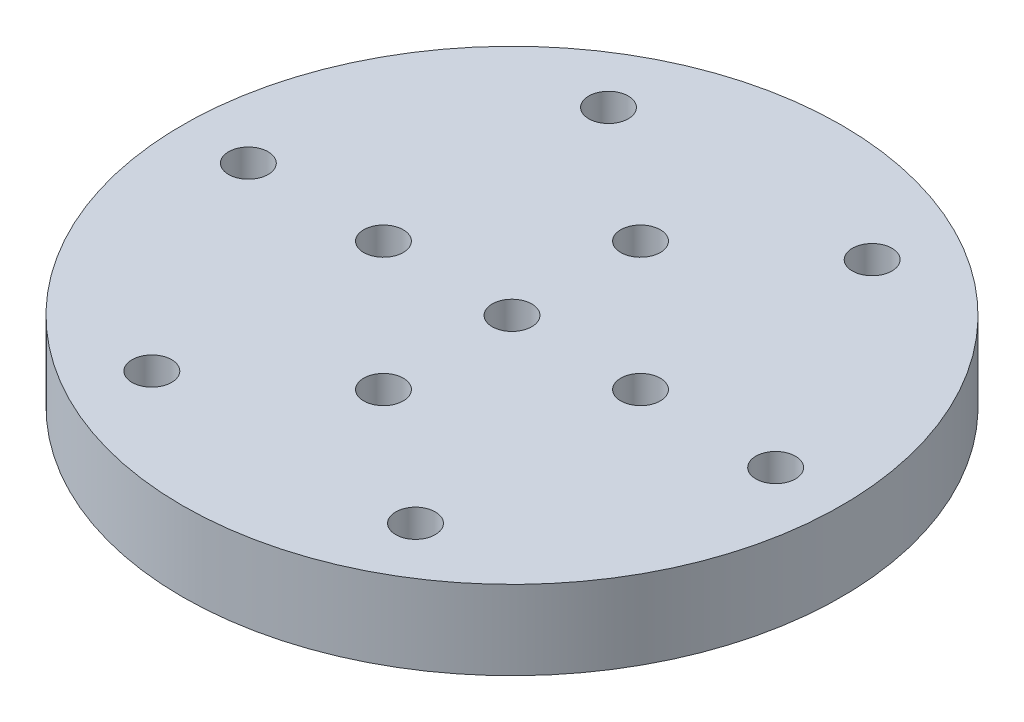
ISO-10303-21;
HEADER;
FILE_DESCRIPTION(('STEP AP214'),'2;1');
FILE_NAME('part.step','',(''),(''),'','','');
FILE_SCHEMA(('AUTOMOTIVE_DESIGN { 1 0 10303 214 1 1 1 1 }'));
ENDSEC;
DATA;
#1=APPLICATION_CONTEXT('core data for automotive mechanical design processes');
#2=APPLICATION_PROTOCOL_DEFINITION('international standard','automotive_design',2000,#1);
#3=PRODUCT_CONTEXT('',#1,'mechanical');
#4=PRODUCT('Part','Part','',(#3));
#5=PRODUCT_RELATED_PRODUCT_CATEGORY('part','',(#4));
#6=PRODUCT_DEFINITION_FORMATION('','',#4);
#7=PRODUCT_DEFINITION_CONTEXT('part definition',#1,'design');
#8=PRODUCT_DEFINITION('design','',#6,#7);
#9=PRODUCT_DEFINITION_SHAPE('','',#8);
#10=(LENGTH_UNIT() NAMED_UNIT(*) SI_UNIT(.MILLI.,.METRE.));
#11=(NAMED_UNIT(*) PLANE_ANGLE_UNIT() SI_UNIT($,.RADIAN.));
#12=(NAMED_UNIT(*) SI_UNIT($,.STERADIAN.) SOLID_ANGLE_UNIT());
#13=UNCERTAINTY_MEASURE_WITH_UNIT(LENGTH_MEASURE(1.E-05),#10,'distance_accuracy_value','');
#14=(GEOMETRIC_REPRESENTATION_CONTEXT(3) GLOBAL_UNCERTAINTY_ASSIGNED_CONTEXT((#13)) GLOBAL_UNIT_ASSIGNED_CONTEXT((#10,
#11,#12)) REPRESENTATION_CONTEXT('',''));
#15=CARTESIAN_POINT('',(0.,0.,0.));
#16=DIRECTION('',(0.,0.,1.));
#17=DIRECTION('',(1.,0.,0.));
#18=AXIS2_PLACEMENT_3D('',#15,#16,#17);
#19=CARTESIAN_POINT('',(0.,6.,0.));
#20=DIRECTION('',(0.,-1.,0.));
#21=DIRECTION('',(0.,0.,-1.));
#22=AXIS2_PLACEMENT_3D('',#19,#20,#21);
#23=CYLINDRICAL_SURFACE('',#22,25.);
#24=CARTESIAN_POINT('',(0.,6.,0.));
#25=DIRECTION('',(0.,1.,0.));
#26=DIRECTION('',(0.,0.,1.));
#27=AXIS2_PLACEMENT_3D('',#24,#25,#26);
#28=CIRCLE('',#27,25.);
#29=CARTESIAN_POINT('',(0.,6.,25.));
#30=VERTEX_POINT('',#29);
#31=EDGE_CURVE('E10',#30,#30,#28,.T.);
#32=ORIENTED_EDGE('',*,*,#31,.F.);
#33=EDGE_LOOP('',(#32));
#34=FACE_BOUND('',#33,.T.);
#35=CARTESIAN_POINT('',(0.,0.,0.));
#36=DIRECTION('',(0.,1.,0.));
#37=DIRECTION('',(0.,0.,1.));
#38=AXIS2_PLACEMENT_3D('',#35,#36,#37);
#39=CIRCLE('',#38,25.);
#40=CARTESIAN_POINT('',(0.,0.,25.));
#41=VERTEX_POINT('',#40);
#42=EDGE_CURVE('E43',#41,#41,#39,.T.);
#43=ORIENTED_EDGE('',*,*,#42,.T.);
#44=EDGE_LOOP('',(#43));
#45=FACE_BOUND('',#44,.T.);
#46=ADVANCED_FACE('F36',(#34,#45),#23,.T.);
#47=CARTESIAN_POINT('',(0.,6.,0.));
#48=DIRECTION('',(0.,1.,0.));
#49=DIRECTION('',(0.,0.,1.));
#50=AXIS2_PLACEMENT_3D('',#47,#48,#49);
#51=PLANE('',#50);
#52=CARTESIAN_POINT('',(-10.0000000000002,6.,17.3205080756887));
#53=DIRECTION('',(0.,1.,0.));
#54=DIRECTION('',(0.,0.,1.));
#55=AXIS2_PLACEMENT_3D('',#52,#53,#54);
#56=CIRCLE('',#55,1.5);
#57=CARTESIAN_POINT('',(-10.0000000000002,6.,18.8205080756887));
#58=VERTEX_POINT('',#57);
#59=EDGE_CURVE('E147',#58,#58,#56,.T.);
#60=ORIENTED_EDGE('',*,*,#59,.F.);
#61=EDGE_LOOP('',(#60));
#62=FACE_BOUND('',#61,.T.);
#63=CARTESIAN_POINT('',(9.99999999999984,6.,17.3205080756889));
#64=DIRECTION('',(0.,1.,0.));
#65=DIRECTION('',(0.,0.,1.));
#66=AXIS2_PLACEMENT_3D('',#63,#64,#65);
#67=CIRCLE('',#66,1.5);
#68=CARTESIAN_POINT('',(9.99999999999984,6.,18.8205080756889));
#69=VERTEX_POINT('',#68);
#70=EDGE_CURVE('E144',#69,#69,#67,.T.);
#71=ORIENTED_EDGE('',*,*,#70,.F.);
#72=EDGE_LOOP('',(#71));
#73=FACE_BOUND('',#72,.T.);
#74=CARTESIAN_POINT('',(1.02125829161162E-13,6.,-9.75));
#75=DIRECTION('',(0.,1.,0.));
#76=DIRECTION('',(0.,0.,1.));
#77=AXIS2_PLACEMENT_3D('',#74,#75,#76);
#78=CIRCLE('',#77,1.5);
#79=CARTESIAN_POINT('',(1.02125829161162E-13,6.,-8.25));
#80=VERTEX_POINT('',#79);
#81=EDGE_CURVE('E141',#80,#80,#78,.T.);
#82=ORIENTED_EDGE('',*,*,#81,.F.);
#83=EDGE_LOOP('',(#82));
#84=FACE_BOUND('',#83,.T.);
#85=CARTESIAN_POINT('',(-9.75,6.,0.));
#86=DIRECTION('',(0.,1.,0.));
#87=DIRECTION('',(0.,0.,1.));
#88=AXIS2_PLACEMENT_3D('',#85,#86,#87);
#89=CIRCLE('',#88,1.5);
#90=CARTESIAN_POINT('',(-9.75,6.,1.49999999999993));
#91=VERTEX_POINT('',#90);
#92=EDGE_CURVE('E138',#91,#91,#89,.T.);
#93=ORIENTED_EDGE('',*,*,#92,.F.);
#94=EDGE_LOOP('',(#93));
#95=FACE_BOUND('',#94,.T.);
#96=CARTESIAN_POINT('',(0.,6.,9.75));
#97=DIRECTION('',(0.,1.,0.));
#98=DIRECTION('',(0.,0.,1.));
#99=AXIS2_PLACEMENT_3D('',#96,#97,#98);
#100=CIRCLE('',#99,1.5);
#101=CARTESIAN_POINT('',(0.,6.,11.25));
#102=VERTEX_POINT('',#101);
#103=EDGE_CURVE('E133',#102,#102,#100,.T.);
#104=ORIENTED_EDGE('',*,*,#103,.F.);
#105=EDGE_LOOP('',(#104));
#106=FACE_BOUND('',#105,.T.);
#107=CARTESIAN_POINT('',(0.,6.,0.));
#108=DIRECTION('',(0.,1.,0.));
#109=DIRECTION('',(0.,0.,1.));
#110=AXIS2_PLACEMENT_3D('',#107,#108,#109);
#111=CIRCLE('',#110,1.5);
#112=CARTESIAN_POINT('',(0.,6.,1.5));
#113=VERTEX_POINT('',#112);
#114=EDGE_CURVE('E131',#113,#113,#111,.T.);
#115=ORIENTED_EDGE('',*,*,#114,.F.);
#116=EDGE_LOOP('',(#115));
#117=FACE_BOUND('',#116,.T.);
#118=CARTESIAN_POINT('',(-20.,6.,0.));
#119=DIRECTION('',(0.,1.,0.));
#120=DIRECTION('',(0.,0.,1.));
#121=AXIS2_PLACEMENT_3D('',#118,#119,#120);
#122=CIRCLE('',#121,1.5);
#123=CARTESIAN_POINT('',(-20.,6.,1.5));
#124=VERTEX_POINT('',#123);
#125=EDGE_CURVE('E164',#124,#124,#122,.T.);
#126=ORIENTED_EDGE('',*,*,#125,.F.);
#127=EDGE_LOOP('',(#126));
#128=FACE_BOUND('',#127,.T.);
#129=CARTESIAN_POINT('',(-9.99999999999996,6.,-17.3205080756888));
#130=DIRECTION('',(0.,1.,0.));
#131=DIRECTION('',(0.,0.,1.));
#132=AXIS2_PLACEMENT_3D('',#129,#130,#131);
#133=CIRCLE('',#132,1.5);
#134=CARTESIAN_POINT('',(-9.99999999999996,6.,-15.8205080756888));
#135=VERTEX_POINT('',#134);
#136=EDGE_CURVE('E168',#135,#135,#133,.T.);
#137=ORIENTED_EDGE('',*,*,#136,.F.);
#138=EDGE_LOOP('',(#137));
#139=FACE_BOUND('',#138,.T.);
#140=CARTESIAN_POINT('',(10.0000000000001,6.,-17.3205080756887));
#141=DIRECTION('',(0.,1.,0.));
#142=DIRECTION('',(0.,0.,1.));
#143=AXIS2_PLACEMENT_3D('',#140,#141,#142);
#144=CIRCLE('',#143,1.5);
#145=CARTESIAN_POINT('',(10.0000000000001,6.,-15.8205080756887));
#146=VERTEX_POINT('',#145);
#147=EDGE_CURVE('E172',#146,#146,#144,.T.);
#148=ORIENTED_EDGE('',*,*,#147,.F.);
#149=EDGE_LOOP('',(#148));
#150=FACE_BOUND('',#149,.T.);
#151=CARTESIAN_POINT('',(20.,6.,1.39659253553725E-13));
#152=DIRECTION('',(0.,1.,0.));
#153=DIRECTION('',(0.,0.,1.));
#154=AXIS2_PLACEMENT_3D('',#151,#152,#153);
#155=CIRCLE('',#154,1.5);
#156=CARTESIAN_POINT('',(20.,6.,1.50000000000014));
#157=VERTEX_POINT('',#156);
#158=EDGE_CURVE('E146',#157,#157,#155,.T.);
#159=ORIENTED_EDGE('',*,*,#158,.F.);
#160=EDGE_LOOP('',(#159));
#161=FACE_BOUND('',#160,.T.);
#162=CARTESIAN_POINT('',(9.75,6.,0.));
#163=DIRECTION('',(0.,1.,0.));
#164=DIRECTION('',(0.,0.,1.));
#165=AXIS2_PLACEMENT_3D('',#162,#163,#164);
#166=CIRCLE('',#165,1.5);
#167=CARTESIAN_POINT('',(9.75,6.,1.5));
#168=VERTEX_POINT('',#167);
#169=EDGE_CURVE('E50',#168,#168,#166,.T.);
#170=ORIENTED_EDGE('',*,*,#169,.F.);
#171=EDGE_LOOP('',(#170));
#172=FACE_BOUND('',#171,.T.);
#173=ORIENTED_EDGE('',*,*,#31,.T.);
#174=EDGE_LOOP('',(#173));
#175=FACE_BOUND('',#174,.T.);
#176=ADVANCED_FACE('F102',(#62,#73,#84,#95,#106,#117,#128,#139,#150,#161,#172,#175),#51,.T.);
#177=CARTESIAN_POINT('',(0.,0.,0.));
#178=DIRECTION('',(0.,1.,0.));
#179=DIRECTION('',(0.,0.,1.));
#180=AXIS2_PLACEMENT_3D('',#177,#178,#179);
#181=PLANE('',#180);
#182=CARTESIAN_POINT('',(-10.0000000000002,0.,17.3205080756887));
#183=DIRECTION('',(0.,1.,0.));
#184=DIRECTION('',(0.,0.,1.));
#185=AXIS2_PLACEMENT_3D('',#182,#183,#184);
#186=CIRCLE('',#185,1.5);
#187=CARTESIAN_POINT('',(-10.0000000000002,0.,18.8205080756887));
#188=VERTEX_POINT('',#187);
#189=EDGE_CURVE('E39',#188,#188,#186,.T.);
#190=ORIENTED_EDGE('',*,*,#189,.T.);
#191=EDGE_LOOP('',(#190));
#192=FACE_BOUND('',#191,.T.);
#193=CARTESIAN_POINT('',(9.99999999999984,0.,17.3205080756889));
#194=DIRECTION('',(0.,1.,0.));
#195=DIRECTION('',(0.,0.,1.));
#196=AXIS2_PLACEMENT_3D('',#193,#194,#195);
#197=CIRCLE('',#196,1.5);
#198=CARTESIAN_POINT('',(9.99999999999984,0.,18.8205080756889));
#199=VERTEX_POINT('',#198);
#200=EDGE_CURVE('E79',#199,#199,#197,.T.);
#201=ORIENTED_EDGE('',*,*,#200,.T.);
#202=EDGE_LOOP('',(#201));
#203=FACE_BOUND('',#202,.T.);
#204=CARTESIAN_POINT('',(1.02125829161162E-13,0.,-9.75));
#205=DIRECTION('',(0.,1.,0.));
#206=DIRECTION('',(0.,0.,1.));
#207=AXIS2_PLACEMENT_3D('',#204,#205,#206);
#208=CIRCLE('',#207,1.5);
#209=CARTESIAN_POINT('',(1.02125829161162E-13,0.,-8.25));
#210=VERTEX_POINT('',#209);
#211=EDGE_CURVE('E77',#210,#210,#208,.T.);
#212=ORIENTED_EDGE('',*,*,#211,.T.);
#213=EDGE_LOOP('',(#212));
#214=FACE_BOUND('',#213,.T.);
#215=CARTESIAN_POINT('',(-9.75,0.,0.));
#216=DIRECTION('',(0.,1.,0.));
#217=DIRECTION('',(0.,0.,1.));
#218=AXIS2_PLACEMENT_3D('',#215,#216,#217);
#219=CIRCLE('',#218,1.5);
#220=CARTESIAN_POINT('',(-9.75,0.,1.49999999999993));
#221=VERTEX_POINT('',#220);
#222=EDGE_CURVE('E74',#221,#221,#219,.T.);
#223=ORIENTED_EDGE('',*,*,#222,.T.);
#224=EDGE_LOOP('',(#223));
#225=FACE_BOUND('',#224,.T.);
#226=CARTESIAN_POINT('',(0.,0.,9.75));
#227=DIRECTION('',(0.,1.,0.));
#228=DIRECTION('',(0.,0.,1.));
#229=AXIS2_PLACEMENT_3D('',#226,#227,#228);
#230=CIRCLE('',#229,1.5);
#231=CARTESIAN_POINT('',(0.,0.,11.25));
#232=VERTEX_POINT('',#231);
#233=EDGE_CURVE('E71',#232,#232,#230,.T.);
#234=ORIENTED_EDGE('',*,*,#233,.T.);
#235=EDGE_LOOP('',(#234));
#236=FACE_BOUND('',#235,.T.);
#237=CARTESIAN_POINT('',(0.,0.,0.));
#238=DIRECTION('',(0.,1.,0.));
#239=DIRECTION('',(0.,0.,1.));
#240=AXIS2_PLACEMENT_3D('',#237,#238,#239);
#241=CIRCLE('',#240,1.5);
#242=CARTESIAN_POINT('',(0.,0.,1.5));
#243=VERTEX_POINT('',#242);
#244=EDGE_CURVE('E68',#243,#243,#241,.T.);
#245=ORIENTED_EDGE('',*,*,#244,.T.);
#246=EDGE_LOOP('',(#245));
#247=FACE_BOUND('',#246,.T.);
#248=CARTESIAN_POINT('',(-20.,0.,0.));
#249=DIRECTION('',(0.,1.,0.));
#250=DIRECTION('',(0.,0.,1.));
#251=AXIS2_PLACEMENT_3D('',#248,#249,#250);
#252=CIRCLE('',#251,1.5);
#253=CARTESIAN_POINT('',(-20.,0.,1.5));
#254=VERTEX_POINT('',#253);
#255=EDGE_CURVE('E65',#254,#254,#252,.T.);
#256=ORIENTED_EDGE('',*,*,#255,.T.);
#257=EDGE_LOOP('',(#256));
#258=FACE_BOUND('',#257,.T.);
#259=CARTESIAN_POINT('',(-9.99999999999996,0.,-17.3205080756888));
#260=DIRECTION('',(0.,1.,0.));
#261=DIRECTION('',(0.,0.,1.));
#262=AXIS2_PLACEMENT_3D('',#259,#260,#261);
#263=CIRCLE('',#262,1.5);
#264=CARTESIAN_POINT('',(-9.99999999999996,0.,-15.8205080756888));
#265=VERTEX_POINT('',#264);
#266=EDGE_CURVE('E62',#265,#265,#263,.T.);
#267=ORIENTED_EDGE('',*,*,#266,.T.);
#268=EDGE_LOOP('',(#267));
#269=FACE_BOUND('',#268,.T.);
#270=CARTESIAN_POINT('',(10.0000000000001,0.,-17.3205080756887));
#271=DIRECTION('',(0.,1.,0.));
#272=DIRECTION('',(0.,0.,1.));
#273=AXIS2_PLACEMENT_3D('',#270,#271,#272);
#274=CIRCLE('',#273,1.5);
#275=CARTESIAN_POINT('',(10.0000000000001,0.,-15.8205080756887));
#276=VERTEX_POINT('',#275);
#277=EDGE_CURVE('E59',#276,#276,#274,.T.);
#278=ORIENTED_EDGE('',*,*,#277,.T.);
#279=EDGE_LOOP('',(#278));
#280=FACE_BOUND('',#279,.T.);
#281=CARTESIAN_POINT('',(20.,0.,1.39659253553725E-13));
#282=DIRECTION('',(0.,1.,0.));
#283=DIRECTION('',(0.,0.,1.));
#284=AXIS2_PLACEMENT_3D('',#281,#282,#283);
#285=CIRCLE('',#284,1.5);
#286=CARTESIAN_POINT('',(20.,0.,1.50000000000014));
#287=VERTEX_POINT('',#286);
#288=EDGE_CURVE('E56',#287,#287,#285,.T.);
#289=ORIENTED_EDGE('',*,*,#288,.T.);
#290=EDGE_LOOP('',(#289));
#291=FACE_BOUND('',#290,.T.);
#292=CARTESIAN_POINT('',(9.75,0.,0.));
#293=DIRECTION('',(0.,1.,0.));
#294=DIRECTION('',(0.,0.,1.));
#295=AXIS2_PLACEMENT_3D('',#292,#293,#294);
#296=CIRCLE('',#295,1.5);
#297=CARTESIAN_POINT('',(9.75,0.,1.5));
#298=VERTEX_POINT('',#297);
#299=EDGE_CURVE('E53',#298,#298,#296,.T.);
#300=ORIENTED_EDGE('',*,*,#299,.T.);
#301=EDGE_LOOP('',(#300));
#302=FACE_BOUND('',#301,.T.);
#303=ORIENTED_EDGE('',*,*,#42,.F.);
#304=EDGE_LOOP('',(#303));
#305=FACE_BOUND('',#304,.T.);
#306=ADVANCED_FACE('F86',(#192,#203,#214,#225,#236,#247,#258,#269,#280,#291,#302,#305),#181,.F.);
#307=CARTESIAN_POINT('',(9.75,-4.,0.));
#308=DIRECTION('',(0.,1.,0.));
#309=DIRECTION('',(0.,0.,1.));
#310=AXIS2_PLACEMENT_3D('',#307,#308,#309);
#311=CYLINDRICAL_SURFACE('',#310,1.5);
#312=ORIENTED_EDGE('',*,*,#169,.T.);
#313=EDGE_LOOP('',(#312));
#314=FACE_BOUND('',#313,.T.);
#315=ORIENTED_EDGE('',*,*,#299,.F.);
#316=EDGE_LOOP('',(#315));
#317=FACE_BOUND('',#316,.T.);
#318=ADVANCED_FACE('F113',(#314,#317),#311,.F.);
#319=CARTESIAN_POINT('',(20.,-4.,1.39659253553725E-13));
#320=DIRECTION('',(0.,1.,0.));
#321=DIRECTION('',(0.,0.,1.));
#322=AXIS2_PLACEMENT_3D('',#319,#320,#321);
#323=CYLINDRICAL_SURFACE('',#322,1.5);
#324=ORIENTED_EDGE('',*,*,#158,.T.);
#325=EDGE_LOOP('',(#324));
#326=FACE_BOUND('',#325,.T.);
#327=ORIENTED_EDGE('',*,*,#288,.F.);
#328=EDGE_LOOP('',(#327));
#329=FACE_BOUND('',#328,.T.);
#330=ADVANCED_FACE('F117',(#326,#329),#323,.F.);
#331=CARTESIAN_POINT('',(10.0000000000001,-4.,-17.3205080756887));
#332=DIRECTION('',(0.,1.,0.));
#333=DIRECTION('',(0.,0.,1.));
#334=AXIS2_PLACEMENT_3D('',#331,#332,#333);
#335=CYLINDRICAL_SURFACE('',#334,1.5);
#336=ORIENTED_EDGE('',*,*,#147,.T.);
#337=EDGE_LOOP('',(#336));
#338=FACE_BOUND('',#337,.T.);
#339=ORIENTED_EDGE('',*,*,#277,.F.);
#340=EDGE_LOOP('',(#339));
#341=FACE_BOUND('',#340,.T.);
#342=ADVANCED_FACE('F122',(#338,#341),#335,.F.);
#343=CARTESIAN_POINT('',(-9.99999999999996,-4.,-17.3205080756888));
#344=DIRECTION('',(0.,1.,0.));
#345=DIRECTION('',(0.,0.,1.));
#346=AXIS2_PLACEMENT_3D('',#343,#344,#345);
#347=CYLINDRICAL_SURFACE('',#346,1.5);
#348=ORIENTED_EDGE('',*,*,#136,.T.);
#349=EDGE_LOOP('',(#348));
#350=FACE_BOUND('',#349,.T.);
#351=ORIENTED_EDGE('',*,*,#266,.F.);
#352=EDGE_LOOP('',(#351));
#353=FACE_BOUND('',#352,.T.);
#354=ADVANCED_FACE('F183',(#350,#353),#347,.F.);
#355=CARTESIAN_POINT('',(-20.,-4.,0.));
#356=DIRECTION('',(0.,1.,0.));
#357=DIRECTION('',(0.,0.,1.));
#358=AXIS2_PLACEMENT_3D('',#355,#356,#357);
#359=CYLINDRICAL_SURFACE('',#358,1.5);
#360=ORIENTED_EDGE('',*,*,#125,.T.);
#361=EDGE_LOOP('',(#360));
#362=FACE_BOUND('',#361,.T.);
#363=ORIENTED_EDGE('',*,*,#255,.F.);
#364=EDGE_LOOP('',(#363));
#365=FACE_BOUND('',#364,.T.);
#366=ADVANCED_FACE('F186',(#362,#365),#359,.F.);
#367=CARTESIAN_POINT('',(0.,-4.,0.));
#368=DIRECTION('',(0.,1.,0.));
#369=DIRECTION('',(0.,0.,1.));
#370=AXIS2_PLACEMENT_3D('',#367,#368,#369);
#371=CYLINDRICAL_SURFACE('',#370,1.5);
#372=ORIENTED_EDGE('',*,*,#114,.T.);
#373=EDGE_LOOP('',(#372));
#374=FACE_BOUND('',#373,.T.);
#375=ORIENTED_EDGE('',*,*,#244,.F.);
#376=EDGE_LOOP('',(#375));
#377=FACE_BOUND('',#376,.T.);
#378=ADVANCED_FACE('F209',(#374,#377),#371,.F.);
#379=CARTESIAN_POINT('',(0.,-4.,9.75));
#380=DIRECTION('',(0.,1.,0.));
#381=DIRECTION('',(0.,0.,1.));
#382=AXIS2_PLACEMENT_3D('',#379,#380,#381);
#383=CYLINDRICAL_SURFACE('',#382,1.5);
#384=ORIENTED_EDGE('',*,*,#103,.T.);
#385=EDGE_LOOP('',(#384));
#386=FACE_BOUND('',#385,.T.);
#387=ORIENTED_EDGE('',*,*,#233,.F.);
#388=EDGE_LOOP('',(#387));
#389=FACE_BOUND('',#388,.T.);
#390=ADVANCED_FACE('F206',(#386,#389),#383,.F.);
#391=CARTESIAN_POINT('',(-9.75,-4.,0.));
#392=DIRECTION('',(0.,1.,0.));
#393=DIRECTION('',(0.,0.,1.));
#394=AXIS2_PLACEMENT_3D('',#391,#392,#393);
#395=CYLINDRICAL_SURFACE('',#394,1.5);
#396=ORIENTED_EDGE('',*,*,#92,.T.);
#397=EDGE_LOOP('',(#396));
#398=FACE_BOUND('',#397,.T.);
#399=ORIENTED_EDGE('',*,*,#222,.F.);
#400=EDGE_LOOP('',(#399));
#401=FACE_BOUND('',#400,.T.);
#402=ADVANCED_FACE('F203',(#398,#401),#395,.F.);
#403=CARTESIAN_POINT('',(1.02125829161162E-13,-4.,-9.75));
#404=DIRECTION('',(0.,1.,0.));
#405=DIRECTION('',(0.,0.,1.));
#406=AXIS2_PLACEMENT_3D('',#403,#404,#405);
#407=CYLINDRICAL_SURFACE('',#406,1.5);
#408=ORIENTED_EDGE('',*,*,#81,.T.);
#409=EDGE_LOOP('',(#408));
#410=FACE_BOUND('',#409,.T.);
#411=ORIENTED_EDGE('',*,*,#211,.F.);
#412=EDGE_LOOP('',(#411));
#413=FACE_BOUND('',#412,.T.);
#414=ADVANCED_FACE('F96',(#410,#413),#407,.F.);
#415=CARTESIAN_POINT('',(9.99999999999984,-4.,17.3205080756889));
#416=DIRECTION('',(0.,1.,0.));
#417=DIRECTION('',(0.,0.,1.));
#418=AXIS2_PLACEMENT_3D('',#415,#416,#417);
#419=CYLINDRICAL_SURFACE('',#418,1.5);
#420=ORIENTED_EDGE('',*,*,#70,.T.);
#421=EDGE_LOOP('',(#420));
#422=FACE_BOUND('',#421,.T.);
#423=ORIENTED_EDGE('',*,*,#200,.F.);
#424=EDGE_LOOP('',(#423));
#425=FACE_BOUND('',#424,.T.);
#426=ADVANCED_FACE('F90',(#422,#425),#419,.F.);
#427=CARTESIAN_POINT('',(-10.0000000000002,-4.,17.3205080756887));
#428=DIRECTION('',(0.,1.,0.));
#429=DIRECTION('',(0.,0.,1.));
#430=AXIS2_PLACEMENT_3D('',#427,#428,#429);
#431=CYLINDRICAL_SURFACE('',#430,1.5);
#432=ORIENTED_EDGE('',*,*,#59,.T.);
#433=EDGE_LOOP('',(#432));
#434=FACE_BOUND('',#433,.T.);
#435=ORIENTED_EDGE('',*,*,#189,.F.);
#436=EDGE_LOOP('',(#435));
#437=FACE_BOUND('',#436,.T.);
#438=ADVANCED_FACE('F88',(#434,#437),#431,.F.);
#439=CLOSED_SHELL('',(#46,#176,#306,#318,#330,#342,#354,#366,#378,#390,#402,#414,#426,#438));
#440=MANIFOLD_SOLID_BREP('B2',#439);
#441=ADVANCED_BREP_SHAPE_REPRESENTATION('',(#18,#440),#14);
#442=SHAPE_DEFINITION_REPRESENTATION(#9,#441);
ENDSEC;
END-ISO-10303-21;
